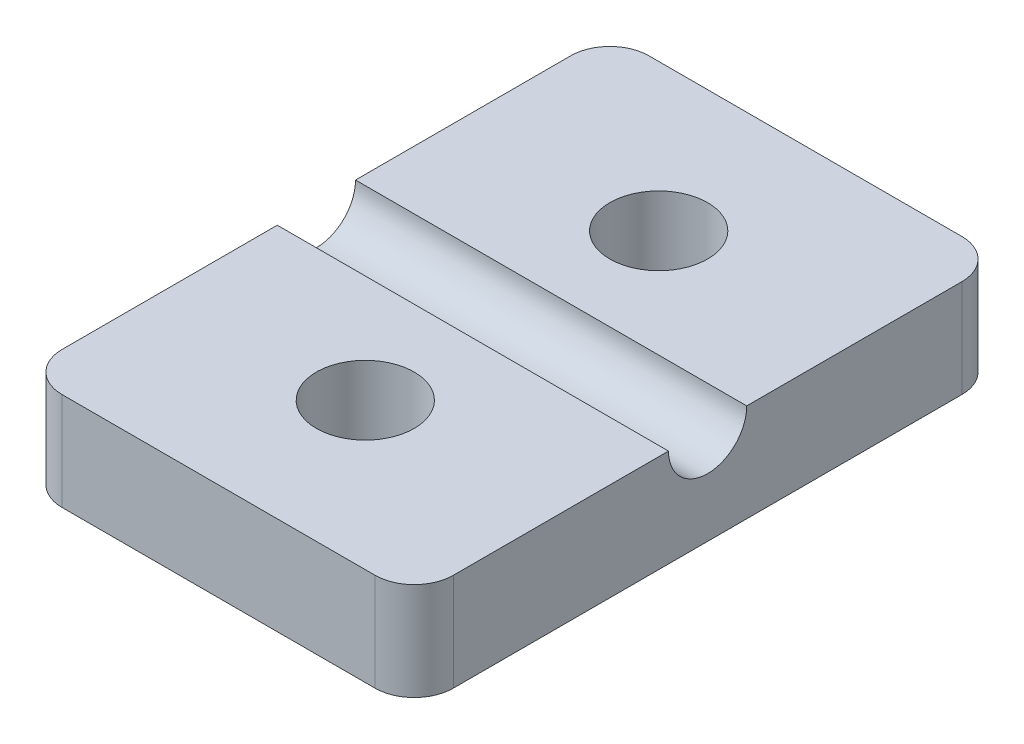
ISO-10303-21;
HEADER;
FILE_DESCRIPTION(('STEP AP214'),'2;1');
FILE_NAME('part.step','',(''),(''),'','','');
FILE_SCHEMA(('AUTOMOTIVE_DESIGN { 1 0 10303 214 1 1 1 1 }'));
ENDSEC;
DATA;
#1=APPLICATION_CONTEXT('core data for automotive mechanical design processes');
#2=APPLICATION_PROTOCOL_DEFINITION('international standard','automotive_design',2000,#1);
#3=PRODUCT_CONTEXT('',#1,'mechanical');
#4=PRODUCT('Part','Part','',(#3));
#5=PRODUCT_RELATED_PRODUCT_CATEGORY('part','',(#4));
#6=PRODUCT_DEFINITION_FORMATION('','',#4);
#7=PRODUCT_DEFINITION_CONTEXT('part definition',#1,'design');
#8=PRODUCT_DEFINITION('design','',#6,#7);
#9=PRODUCT_DEFINITION_SHAPE('','',#8);
#10=(LENGTH_UNIT() NAMED_UNIT(*) SI_UNIT(.MILLI.,.METRE.));
#11=(NAMED_UNIT(*) PLANE_ANGLE_UNIT() SI_UNIT($,.RADIAN.));
#12=(NAMED_UNIT(*) SI_UNIT($,.STERADIAN.) SOLID_ANGLE_UNIT());
#13=UNCERTAINTY_MEASURE_WITH_UNIT(LENGTH_MEASURE(1.E-05),#10,'distance_accuracy_value','');
#14=(GEOMETRIC_REPRESENTATION_CONTEXT(3) GLOBAL_UNCERTAINTY_ASSIGNED_CONTEXT((#13)) GLOBAL_UNIT_ASSIGNED_CONTEXT((#10,
#11,#12)) REPRESENTATION_CONTEXT('',''));
#15=CARTESIAN_POINT('',(0.,0.,0.));
#16=DIRECTION('',(0.,0.,1.));
#17=DIRECTION('',(1.,0.,0.));
#18=AXIS2_PLACEMENT_3D('',#15,#16,#17);
#19=CARTESIAN_POINT('',(10.,1.25,0.));
#20=DIRECTION('',(-1.,0.,0.));
#21=DIRECTION('',(0.,0.,1.));
#22=AXIS2_PLACEMENT_3D('',#19,#20,#21);
#23=CYLINDRICAL_SURFACE('',#22,1.);
#24=CARTESIAN_POINT('',(0.,1.25,0.));
#25=DIRECTION('',(1.,0.,0.));
#26=DIRECTION('',(0.,0.,-1.));
#27=AXIS2_PLACEMENT_3D('',#24,#25,#26);
#28=CIRCLE('',#27,1.);
#29=CARTESIAN_POINT('',(0.,1.25,1.00000000000001));
#30=VERTEX_POINT('',#29);
#31=CARTESIAN_POINT('',(0.,1.25,-0.999999999999991));
#32=VERTEX_POINT('',#31);
#33=EDGE_CURVE('E140',#30,#32,#28,.T.);
#34=ORIENTED_EDGE('',*,*,#33,.F.);
#35=DIRECTION('',(-1.,0.,0.));
#36=VECTOR('',#35,1.);
#37=CARTESIAN_POINT('',(10.,1.25,1.00000000000001));
#38=LINE('',#37,#36);
#39=CARTESIAN_POINT('',(10.,1.25,1.00000000000001));
#40=VERTEX_POINT('',#39);
#41=EDGE_CURVE('E122',#40,#30,#38,.T.);
#42=ORIENTED_EDGE('',*,*,#41,.F.);
#43=CARTESIAN_POINT('',(10.,1.25,0.));
#44=DIRECTION('',(1.,0.,0.));
#45=DIRECTION('',(0.,0.,-1.));
#46=AXIS2_PLACEMENT_3D('',#43,#44,#45);
#47=CIRCLE('',#46,1.);
#48=CARTESIAN_POINT('',(10.,1.25,-0.999999999999991));
#49=VERTEX_POINT('',#48);
#50=EDGE_CURVE('E133',#40,#49,#47,.T.);
#51=ORIENTED_EDGE('',*,*,#50,.T.);
#52=DIRECTION('',(-1.,0.,0.));
#53=VECTOR('',#52,1.);
#54=CARTESIAN_POINT('',(10.,1.25,-0.999999999999991));
#55=LINE('',#54,#53);
#56=EDGE_CURVE('E168',#49,#32,#55,.T.);
#57=ORIENTED_EDGE('',*,*,#56,.T.);
#58=EDGE_LOOP('',(#34,#42,#51,#57));
#59=FACE_BOUND('',#58,.T.);
#60=ADVANCED_FACE('F40',(#59),#23,.F.);
#61=CARTESIAN_POINT('',(10.,1.25,0.));
#62=DIRECTION('',(0.,1.,0.));
#63=DIRECTION('',(0.,0.,1.));
#64=AXIS2_PLACEMENT_3D('',#61,#62,#63);
#65=PLANE('',#64);
#66=CARTESIAN_POINT('',(5.,1.25,3.75000000000001));
#67=DIRECTION('',(0.,1.,0.));
#68=DIRECTION('',(0.,0.,1.));
#69=AXIS2_PLACEMENT_3D('',#66,#67,#68);
#70=CIRCLE('',#69,1.25);
#71=CARTESIAN_POINT('',(5.,1.25,5.00000000000001));
#72=VERTEX_POINT('',#71);
#73=EDGE_CURVE('E155',#72,#72,#70,.T.);
#74=ORIENTED_EDGE('',*,*,#73,.F.);
#75=EDGE_LOOP('',(#74));
#76=FACE_BOUND('',#75,.T.);
#77=DIRECTION('',(0.,0.,-1.));
#78=VECTOR('',#77,1.);
#79=CARTESIAN_POINT('',(0.,1.25,0.));
#80=LINE('',#79,#78);
#81=CARTESIAN_POINT('',(0.,1.25,6.50000000000001));
#82=VERTEX_POINT('',#81);
#83=EDGE_CURVE('E153',#82,#30,#80,.T.);
#84=ORIENTED_EDGE('',*,*,#83,.F.);
#85=CARTESIAN_POINT('',(0.999999999999999,1.25,6.50000000000001));
#86=DIRECTION('',(0.,1.,0.));
#87=DIRECTION('',(0.,0.,1.));
#88=AXIS2_PLACEMENT_3D('',#85,#86,#87);
#89=CIRCLE('',#88,1.);
#90=CARTESIAN_POINT('',(0.999999999999999,1.25,7.50000000000001));
#91=VERTEX_POINT('',#90);
#92=EDGE_CURVE('E211',#82,#91,#89,.T.);
#93=ORIENTED_EDGE('',*,*,#92,.T.);
#94=DIRECTION('',(-1.,0.,0.));
#95=VECTOR('',#94,1.);
#96=CARTESIAN_POINT('',(10.,1.25,7.50000000000001));
#97=LINE('',#96,#95);
#98=CARTESIAN_POINT('',(9.,1.25,7.50000000000001));
#99=VERTEX_POINT('',#98);
#100=EDGE_CURVE('E143',#99,#91,#97,.T.);
#101=ORIENTED_EDGE('',*,*,#100,.F.);
#102=CARTESIAN_POINT('',(9.,1.25,6.50000000000001));
#103=DIRECTION('',(0.,1.,0.));
#104=DIRECTION('',(0.,0.,1.));
#105=AXIS2_PLACEMENT_3D('',#102,#103,#104);
#106=CIRCLE('',#105,1.);
#107=CARTESIAN_POINT('',(10.,1.25,6.50000000000001));
#108=VERTEX_POINT('',#107);
#109=EDGE_CURVE('E126',#99,#108,#106,.T.);
#110=ORIENTED_EDGE('',*,*,#109,.T.);
#111=DIRECTION('',(0.,0.,-1.));
#112=VECTOR('',#111,1.);
#113=CARTESIAN_POINT('',(10.,1.25,0.));
#114=LINE('',#113,#112);
#115=EDGE_CURVE('E118',#108,#40,#114,.T.);
#116=ORIENTED_EDGE('',*,*,#115,.T.);
#117=ORIENTED_EDGE('',*,*,#41,.T.);
#118=EDGE_LOOP('',(#84,#93,#101,#110,#116,#117));
#119=FACE_BOUND('',#118,.T.);
#120=ADVANCED_FACE('F121',(#76,#119),#65,.T.);
#121=CARTESIAN_POINT('',(10.,0.,7.50000000000001));
#122=DIRECTION('',(0.,0.,-1.));
#123=DIRECTION('',(0.,1.,0.));
#124=AXIS2_PLACEMENT_3D('',#121,#122,#123);
#125=PLANE('',#124);
#126=ORIENTED_EDGE('',*,*,#100,.T.);
#127=DIRECTION('',(0.,-1.,0.));
#128=VECTOR('',#127,1.);
#129=CARTESIAN_POINT('',(0.999999999999999,0.,7.50000000000001));
#130=LINE('',#129,#128);
#131=CARTESIAN_POINT('',(0.999999999999999,-1.25,7.50000000000001));
#132=VERTEX_POINT('',#131);
#133=EDGE_CURVE('E186',#91,#132,#130,.T.);
#134=ORIENTED_EDGE('',*,*,#133,.T.);
#135=DIRECTION('',(-1.,0.,0.));
#136=VECTOR('',#135,1.);
#137=CARTESIAN_POINT('',(10.,-1.25,7.50000000000001));
#138=LINE('',#137,#136);
#139=CARTESIAN_POINT('',(9.,-1.25,7.50000000000001));
#140=VERTEX_POINT('',#139);
#141=EDGE_CURVE('E177',#140,#132,#138,.T.);
#142=ORIENTED_EDGE('',*,*,#141,.F.);
#143=DIRECTION('',(0.,-1.,0.));
#144=VECTOR('',#143,1.);
#145=CARTESIAN_POINT('',(9.,1.25,7.50000000000001));
#146=LINE('',#145,#144);
#147=EDGE_CURVE('E142',#140,#99,#146,.F.);
#148=ORIENTED_EDGE('',*,*,#147,.T.);
#149=EDGE_LOOP('',(#126,#134,#142,#148));
#150=FACE_BOUND('',#149,.T.);
#151=ADVANCED_FACE('F251',(#150),#125,.F.);
#152=CARTESIAN_POINT('',(10.,-1.25,0.));
#153=DIRECTION('',(0.,1.,0.));
#154=DIRECTION('',(0.,0.,1.));
#155=AXIS2_PLACEMENT_3D('',#152,#153,#154);
#156=PLANE('',#155);
#157=CARTESIAN_POINT('',(5.,-1.25,-3.74999999999999));
#158=DIRECTION('',(0.,1.,0.));
#159=DIRECTION('',(0.,0.,1.));
#160=AXIS2_PLACEMENT_3D('',#157,#158,#159);
#161=CIRCLE('',#160,1.25);
#162=CARTESIAN_POINT('',(5.,-1.25,-2.49999999999999));
#163=VERTEX_POINT('',#162);
#164=EDGE_CURVE('E162',#163,#163,#161,.T.);
#165=ORIENTED_EDGE('',*,*,#164,.T.);
#166=EDGE_LOOP('',(#165));
#167=FACE_BOUND('',#166,.T.);
#168=CARTESIAN_POINT('',(5.,-1.25,3.75000000000001));
#169=DIRECTION('',(0.,1.,0.));
#170=DIRECTION('',(0.,0.,1.));
#171=AXIS2_PLACEMENT_3D('',#168,#169,#170);
#172=CIRCLE('',#171,1.25);
#173=CARTESIAN_POINT('',(5.,-1.25,5.00000000000001));
#174=VERTEX_POINT('',#173);
#175=EDGE_CURVE('E299',#174,#174,#172,.T.);
#176=ORIENTED_EDGE('',*,*,#175,.T.);
#177=EDGE_LOOP('',(#176));
#178=FACE_BOUND('',#177,.T.);
#179=ORIENTED_EDGE('',*,*,#141,.T.);
#180=CARTESIAN_POINT('',(0.999999999999999,-1.25,6.50000000000001));
#181=DIRECTION('',(0.,1.,0.));
#182=DIRECTION('',(0.,0.,1.));
#183=AXIS2_PLACEMENT_3D('',#180,#181,#182);
#184=CIRCLE('',#183,1.);
#185=CARTESIAN_POINT('',(0.,-1.25,6.50000000000001));
#186=VERTEX_POINT('',#185);
#187=EDGE_CURVE('E199',#132,#186,#184,.F.);
#188=ORIENTED_EDGE('',*,*,#187,.T.);
#189=DIRECTION('',(0.,0.,-1.));
#190=VECTOR('',#189,1.);
#191=CARTESIAN_POINT('',(0.,-1.25,0.));
#192=LINE('',#191,#190);
#193=CARTESIAN_POINT('',(0.,-1.25,-6.49999999999999));
#194=VERTEX_POINT('',#193);
#195=EDGE_CURVE('E151',#186,#194,#192,.T.);
#196=ORIENTED_EDGE('',*,*,#195,.T.);
#197=CARTESIAN_POINT('',(1.,-1.25,-6.49999999999999));
#198=DIRECTION('',(0.,1.,0.));
#199=DIRECTION('',(0.,0.,1.));
#200=AXIS2_PLACEMENT_3D('',#197,#198,#199);
#201=CIRCLE('',#200,1.);
#202=CARTESIAN_POINT('',(0.999999999999999,-1.25,-7.49999999999999));
#203=VERTEX_POINT('',#202);
#204=EDGE_CURVE('E193',#194,#203,#201,.F.);
#205=ORIENTED_EDGE('',*,*,#204,.T.);
#206=DIRECTION('',(-1.,0.,0.));
#207=VECTOR('',#206,1.);
#208=CARTESIAN_POINT('',(10.,-1.25,-7.49999999999999));
#209=LINE('',#208,#207);
#210=CARTESIAN_POINT('',(9.,-1.25,-7.49999999999999));
#211=VERTEX_POINT('',#210);
#212=EDGE_CURVE('E174',#211,#203,#209,.T.);
#213=ORIENTED_EDGE('',*,*,#212,.F.);
#214=CARTESIAN_POINT('',(9.,-1.25,-6.49999999999999));
#215=DIRECTION('',(0.,1.,0.));
#216=DIRECTION('',(0.,0.,1.));
#217=AXIS2_PLACEMENT_3D('',#214,#215,#216);
#218=CIRCLE('',#217,1.);
#219=CARTESIAN_POINT('',(10.,-1.25,-6.49999999999999));
#220=VERTEX_POINT('',#219);
#221=EDGE_CURVE('E190',#211,#220,#218,.F.);
#222=ORIENTED_EDGE('',*,*,#221,.T.);
#223=DIRECTION('',(0.,0.,-1.));
#224=VECTOR('',#223,1.);
#225=CARTESIAN_POINT('',(10.,-1.25,0.));
#226=LINE('',#225,#224);
#227=CARTESIAN_POINT('',(10.,-1.25,6.50000000000001));
#228=VERTEX_POINT('',#227);
#229=EDGE_CURVE('E132',#228,#220,#226,.T.);
#230=ORIENTED_EDGE('',*,*,#229,.F.);
#231=CARTESIAN_POINT('',(9.,-1.25,6.50000000000001));
#232=DIRECTION('',(0.,1.,0.));
#233=DIRECTION('',(0.,0.,1.));
#234=AXIS2_PLACEMENT_3D('',#231,#232,#233);
#235=CIRCLE('',#234,1.);
#236=EDGE_CURVE('E196',#228,#140,#235,.F.);
#237=ORIENTED_EDGE('',*,*,#236,.T.);
#238=EDGE_LOOP('',(#179,#188,#196,#205,#213,#222,#230,#237));
#239=FACE_BOUND('',#238,.T.);
#240=ADVANCED_FACE('F235',(#167,#178,#239),#156,.F.);
#241=CARTESIAN_POINT('',(10.,0.,-7.49999999999999));
#242=DIRECTION('',(0.,0.,-1.));
#243=DIRECTION('',(0.,1.,0.));
#244=AXIS2_PLACEMENT_3D('',#241,#242,#243);
#245=PLANE('',#244);
#246=ORIENTED_EDGE('',*,*,#212,.T.);
#247=DIRECTION('',(0.,-1.,0.));
#248=VECTOR('',#247,1.);
#249=CARTESIAN_POINT('',(1.,1.25,-7.49999999999999));
#250=LINE('',#249,#248);
#251=CARTESIAN_POINT('',(0.999999999999999,1.25,-7.49999999999999));
#252=VERTEX_POINT('',#251);
#253=EDGE_CURVE('E56',#203,#252,#250,.F.);
#254=ORIENTED_EDGE('',*,*,#253,.T.);
#255=DIRECTION('',(-1.,0.,0.));
#256=VECTOR('',#255,1.);
#257=CARTESIAN_POINT('',(10.,1.25,-7.49999999999999));
#258=LINE('',#257,#256);
#259=CARTESIAN_POINT('',(9.,1.25,-7.49999999999999));
#260=VERTEX_POINT('',#259);
#261=EDGE_CURVE('E171',#260,#252,#258,.T.);
#262=ORIENTED_EDGE('',*,*,#261,.F.);
#263=DIRECTION('',(0.,-1.,0.));
#264=VECTOR('',#263,1.);
#265=CARTESIAN_POINT('',(9.,0.,-7.49999999999999));
#266=LINE('',#265,#264);
#267=EDGE_CURVE('E220',#260,#211,#266,.T.);
#268=ORIENTED_EDGE('',*,*,#267,.T.);
#269=EDGE_LOOP('',(#246,#254,#262,#268));
#270=FACE_BOUND('',#269,.T.);
#271=ADVANCED_FACE('F233',(#270),#245,.T.);
#272=CARTESIAN_POINT('',(5.,1.25,-3.74999999999999));
#273=DIRECTION('',(0.,1.,0.));
#274=DIRECTION('',(0.,0.,1.));
#275=AXIS2_PLACEMENT_3D('',#272,#273,#274);
#276=CIRCLE('',#275,1.25);
#277=CARTESIAN_POINT('',(5.,1.25,-2.49999999999999));
#278=VERTEX_POINT('',#277);
#279=EDGE_CURVE('E297',#278,#278,#276,.T.);
#280=ORIENTED_EDGE('',*,*,#279,.F.);
#281=EDGE_LOOP('',(#280));
#282=FACE_BOUND('',#281,.T.);
#283=ORIENTED_EDGE('',*,*,#261,.T.);
#284=CARTESIAN_POINT('',(1.,1.25,-6.49999999999999));
#285=DIRECTION('',(0.,1.,0.));
#286=DIRECTION('',(0.,0.,1.));
#287=AXIS2_PLACEMENT_3D('',#284,#285,#286);
#288=CIRCLE('',#287,1.);
#289=CARTESIAN_POINT('',(0.,1.25,-6.49999999999999));
#290=VERTEX_POINT('',#289);
#291=EDGE_CURVE('E11',#252,#290,#288,.T.);
#292=ORIENTED_EDGE('',*,*,#291,.T.);
#293=EDGE_CURVE('E147',#32,#290,#80,.T.);
#294=ORIENTED_EDGE('',*,*,#293,.F.);
#295=ORIENTED_EDGE('',*,*,#56,.F.);
#296=CARTESIAN_POINT('',(10.,1.25,-6.49999999999999));
#297=VERTEX_POINT('',#296);
#298=EDGE_CURVE('E135',#49,#297,#114,.T.);
#299=ORIENTED_EDGE('',*,*,#298,.T.);
#300=CARTESIAN_POINT('',(9.,1.25,-6.49999999999999));
#301=DIRECTION('',(0.,1.,0.));
#302=DIRECTION('',(0.,0.,1.));
#303=AXIS2_PLACEMENT_3D('',#300,#301,#302);
#304=CIRCLE('',#303,1.);
#305=EDGE_CURVE('E49',#297,#260,#304,.T.);
#306=ORIENTED_EDGE('',*,*,#305,.T.);
#307=EDGE_LOOP('',(#283,#292,#294,#295,#299,#306));
#308=FACE_BOUND('',#307,.T.);
#309=ADVANCED_FACE('F227',(#282,#308),#65,.T.);
#310=CARTESIAN_POINT('',(10.,0.,0.));
#311=DIRECTION('',(1.,0.,0.));
#312=DIRECTION('',(0.,0.,-1.));
#313=AXIS2_PLACEMENT_3D('',#310,#311,#312);
#314=PLANE('',#313);
#315=ORIENTED_EDGE('',*,*,#115,.F.);
#316=DIRECTION('',(0.,-1.,0.));
#317=VECTOR('',#316,1.);
#318=CARTESIAN_POINT('',(10.,-1.25,6.50000000000001));
#319=LINE('',#318,#317);
#320=EDGE_CURVE('E217',#108,#228,#319,.T.);
#321=ORIENTED_EDGE('',*,*,#320,.T.);
#322=ORIENTED_EDGE('',*,*,#229,.T.);
#323=DIRECTION('',(0.,-1.,0.));
#324=VECTOR('',#323,1.);
#325=CARTESIAN_POINT('',(10.,0.,-6.49999999999999));
#326=LINE('',#325,#324);
#327=EDGE_CURVE('E214',#220,#297,#326,.F.);
#328=ORIENTED_EDGE('',*,*,#327,.T.);
#329=ORIENTED_EDGE('',*,*,#298,.F.);
#330=ORIENTED_EDGE('',*,*,#50,.F.);
#331=EDGE_LOOP('',(#315,#321,#322,#328,#329,#330));
#332=FACE_BOUND('',#331,.T.);
#333=ADVANCED_FACE('F145',(#332),#314,.T.);
#334=CARTESIAN_POINT('',(0.,0.,0.));
#335=DIRECTION('',(1.,0.,0.));
#336=DIRECTION('',(0.,0.,-1.));
#337=AXIS2_PLACEMENT_3D('',#334,#335,#336);
#338=PLANE('',#337);
#339=ORIENTED_EDGE('',*,*,#195,.F.);
#340=DIRECTION('',(0.,-1.,0.));
#341=VECTOR('',#340,1.);
#342=CARTESIAN_POINT('',(0.,0.,6.50000000000001));
#343=LINE('',#342,#341);
#344=EDGE_CURVE('E206',#186,#82,#343,.F.);
#345=ORIENTED_EDGE('',*,*,#344,.T.);
#346=ORIENTED_EDGE('',*,*,#83,.T.);
#347=ORIENTED_EDGE('',*,*,#33,.T.);
#348=ORIENTED_EDGE('',*,*,#293,.T.);
#349=DIRECTION('',(0.,-1.,0.));
#350=VECTOR('',#349,1.);
#351=CARTESIAN_POINT('',(0.,-1.25,-6.49999999999999));
#352=LINE('',#351,#350);
#353=EDGE_CURVE('E202',#290,#194,#352,.T.);
#354=ORIENTED_EDGE('',*,*,#353,.T.);
#355=EDGE_LOOP('',(#339,#345,#346,#347,#348,#354));
#356=FACE_BOUND('',#355,.T.);
#357=ADVANCED_FACE('F243',(#356),#338,.F.);
#358=CARTESIAN_POINT('',(5.,-1.25,-3.74999999999999));
#359=DIRECTION('',(0.,1.,0.));
#360=DIRECTION('',(0.,0.,1.));
#361=AXIS2_PLACEMENT_3D('',#358,#359,#360);
#362=CYLINDRICAL_SURFACE('',#361,1.25);
#363=ORIENTED_EDGE('',*,*,#164,.F.);
#364=EDGE_LOOP('',(#363));
#365=FACE_BOUND('',#364,.T.);
#366=ORIENTED_EDGE('',*,*,#279,.T.);
#367=EDGE_LOOP('',(#366));
#368=FACE_BOUND('',#367,.T.);
#369=ADVANCED_FACE('F282',(#365,#368),#362,.F.);
#370=CARTESIAN_POINT('',(5.,-1.25,3.75000000000001));
#371=DIRECTION('',(0.,1.,0.));
#372=DIRECTION('',(0.,0.,1.));
#373=AXIS2_PLACEMENT_3D('',#370,#371,#372);
#374=CYLINDRICAL_SURFACE('',#373,1.25);
#375=ORIENTED_EDGE('',*,*,#175,.F.);
#376=EDGE_LOOP('',(#375));
#377=FACE_BOUND('',#376,.T.);
#378=ORIENTED_EDGE('',*,*,#73,.T.);
#379=EDGE_LOOP('',(#378));
#380=FACE_BOUND('',#379,.T.);
#381=ADVANCED_FACE('F261',(#377,#380),#374,.F.);
#382=CARTESIAN_POINT('',(0.999999999999999,0.,6.50000000000001));
#383=DIRECTION('',(0.,-1.,0.));
#384=DIRECTION('',(0.,0.,-1.));
#385=AXIS2_PLACEMENT_3D('',#382,#383,#384);
#386=CYLINDRICAL_SURFACE('',#385,1.);
#387=ORIENTED_EDGE('',*,*,#92,.F.);
#388=ORIENTED_EDGE('',*,*,#344,.F.);
#389=ORIENTED_EDGE('',*,*,#187,.F.);
#390=ORIENTED_EDGE('',*,*,#133,.F.);
#391=EDGE_LOOP('',(#387,#388,#389,#390));
#392=FACE_BOUND('',#391,.T.);
#393=ADVANCED_FACE('F248',(#392),#386,.T.);
#394=CARTESIAN_POINT('',(9.,0.,6.50000000000001));
#395=DIRECTION('',(0.,1.,0.));
#396=DIRECTION('',(0.,0.,1.));
#397=AXIS2_PLACEMENT_3D('',#394,#395,#396);
#398=CYLINDRICAL_SURFACE('',#397,1.);
#399=ORIENTED_EDGE('',*,*,#109,.F.);
#400=ORIENTED_EDGE('',*,*,#147,.F.);
#401=ORIENTED_EDGE('',*,*,#236,.F.);
#402=ORIENTED_EDGE('',*,*,#320,.F.);
#403=EDGE_LOOP('',(#399,#400,#401,#402));
#404=FACE_BOUND('',#403,.T.);
#405=ADVANCED_FACE('F254',(#404),#398,.T.);
#406=CARTESIAN_POINT('',(1.,0.,-6.49999999999999));
#407=DIRECTION('',(0.,1.,0.));
#408=DIRECTION('',(0.,0.,1.));
#409=AXIS2_PLACEMENT_3D('',#406,#407,#408);
#410=CYLINDRICAL_SURFACE('',#409,1.);
#411=ORIENTED_EDGE('',*,*,#291,.F.);
#412=ORIENTED_EDGE('',*,*,#253,.F.);
#413=ORIENTED_EDGE('',*,*,#204,.F.);
#414=ORIENTED_EDGE('',*,*,#353,.F.);
#415=EDGE_LOOP('',(#411,#412,#413,#414));
#416=FACE_BOUND('',#415,.T.);
#417=ADVANCED_FACE('F241',(#416),#410,.T.);
#418=CARTESIAN_POINT('',(9.,0.,-6.49999999999999));
#419=DIRECTION('',(0.,-1.,0.));
#420=DIRECTION('',(0.,0.,-1.));
#421=AXIS2_PLACEMENT_3D('',#418,#419,#420);
#422=CYLINDRICAL_SURFACE('',#421,1.);
#423=ORIENTED_EDGE('',*,*,#305,.F.);
#424=ORIENTED_EDGE('',*,*,#327,.F.);
#425=ORIENTED_EDGE('',*,*,#221,.F.);
#426=ORIENTED_EDGE('',*,*,#267,.F.);
#427=EDGE_LOOP('',(#423,#424,#425,#426));
#428=FACE_BOUND('',#427,.T.);
#429=ADVANCED_FACE('F42',(#428),#422,.T.);
#430=CLOSED_SHELL('',(#60,#120,#151,#240,#271,#309,#333,#357,#369,#381,#393,#405,#417,#429));
#431=MANIFOLD_SOLID_BREP('B2',#430);
#432=ADVANCED_BREP_SHAPE_REPRESENTATION('',(#18,#431),#14);
#433=SHAPE_DEFINITION_REPRESENTATION(#9,#432);
ENDSEC;
END-ISO-10303-21;
